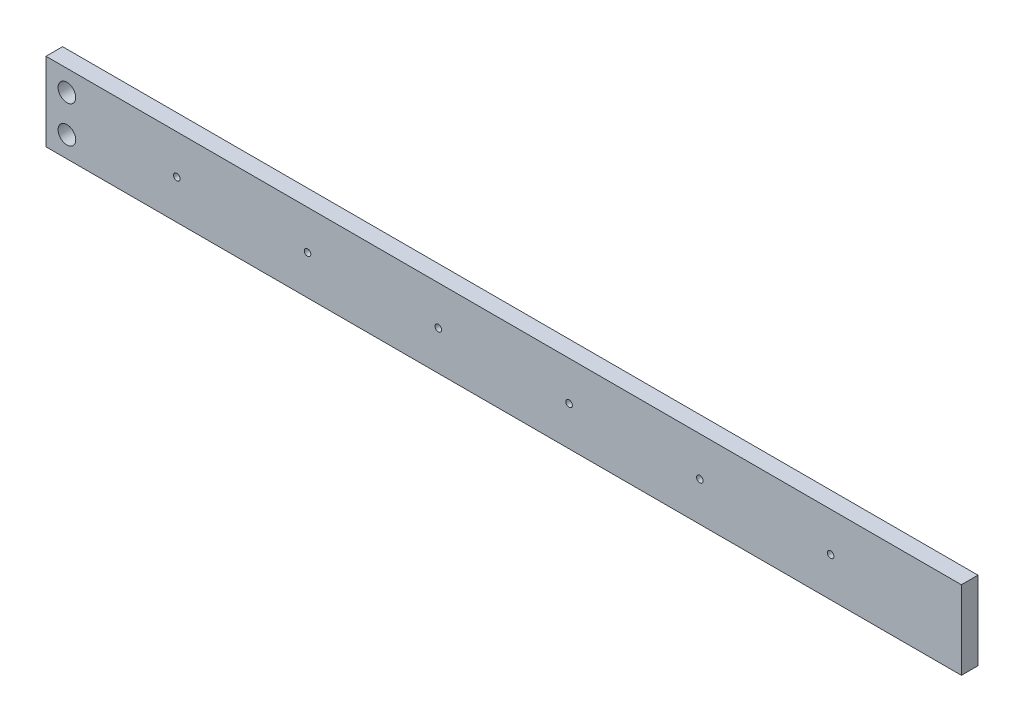
ISO-10303-21;
HEADER;
FILE_DESCRIPTION(('STEP AP214'),'2;1');
FILE_NAME('part.step','',(''),(''),'','','');
FILE_SCHEMA(('AUTOMOTIVE_DESIGN { 1 0 10303 214 1 1 1 1 }'));
ENDSEC;
DATA;
#1=APPLICATION_CONTEXT('core data for automotive mechanical design processes');
#2=APPLICATION_PROTOCOL_DEFINITION('international standard','automotive_design',2000,#1);
#3=PRODUCT_CONTEXT('',#1,'mechanical');
#4=PRODUCT('Part','Part','',(#3));
#5=PRODUCT_RELATED_PRODUCT_CATEGORY('part','',(#4));
#6=PRODUCT_DEFINITION_FORMATION('','',#4);
#7=PRODUCT_DEFINITION_CONTEXT('part definition',#1,'design');
#8=PRODUCT_DEFINITION('design','',#6,#7);
#9=PRODUCT_DEFINITION_SHAPE('','',#8);
#10=(LENGTH_UNIT() NAMED_UNIT(*) SI_UNIT(.MILLI.,.METRE.));
#11=(NAMED_UNIT(*) PLANE_ANGLE_UNIT() SI_UNIT($,.RADIAN.));
#12=(NAMED_UNIT(*) SI_UNIT($,.STERADIAN.) SOLID_ANGLE_UNIT());
#13=UNCERTAINTY_MEASURE_WITH_UNIT(LENGTH_MEASURE(1.E-05),#10,'distance_accuracy_value','');
#14=(GEOMETRIC_REPRESENTATION_CONTEXT(3) GLOBAL_UNCERTAINTY_ASSIGNED_CONTEXT((#13)) GLOBAL_UNIT_ASSIGNED_CONTEXT((#10,
#11,#12)) REPRESENTATION_CONTEXT('',''));
#15=CARTESIAN_POINT('',(0.,0.,0.));
#16=DIRECTION('',(0.,0.,1.));
#17=DIRECTION('',(1.,0.,0.));
#18=AXIS2_PLACEMENT_3D('',#15,#16,#17);
#19=CARTESIAN_POINT('',(300.,15.,6.35));
#20=DIRECTION('',(0.,0.,1.));
#21=DIRECTION('',(1.,0.,0.));
#22=AXIS2_PLACEMENT_3D('',#19,#20,#21);
#23=CYLINDRICAL_SURFACE('',#22,1.25);
#24=CARTESIAN_POINT('',(300.,15.,0.));
#25=DIRECTION('',(0.,0.,1.));
#26=DIRECTION('',(1.,0.,0.));
#27=AXIS2_PLACEMENT_3D('',#24,#25,#26);
#28=CIRCLE('',#27,1.25);
#29=CARTESIAN_POINT('',(301.25,15.,0.));
#30=VERTEX_POINT('',#29);
#31=EDGE_CURVE('E54',#30,#30,#28,.T.);
#32=ORIENTED_EDGE('',*,*,#31,.F.);
#33=EDGE_LOOP('',(#32));
#34=FACE_BOUND('',#33,.T.);
#35=CARTESIAN_POINT('',(300.,15.,6.35));
#36=DIRECTION('',(0.,0.,1.));
#37=DIRECTION('',(1.,0.,0.));
#38=AXIS2_PLACEMENT_3D('',#35,#36,#37);
#39=CIRCLE('',#38,1.25);
#40=CARTESIAN_POINT('',(301.25,15.,6.35));
#41=VERTEX_POINT('',#40);
#42=EDGE_CURVE('E11',#41,#41,#39,.T.);
#43=ORIENTED_EDGE('',*,*,#42,.T.);
#44=EDGE_LOOP('',(#43));
#45=FACE_BOUND('',#44,.T.);
#46=ADVANCED_FACE('F45',(#34,#45),#23,.F.);
#47=CARTESIAN_POINT('',(250.,15.,6.35));
#48=DIRECTION('',(0.,0.,1.));
#49=DIRECTION('',(1.,0.,0.));
#50=AXIS2_PLACEMENT_3D('',#47,#48,#49);
#51=CYLINDRICAL_SURFACE('',#50,1.25);
#52=CARTESIAN_POINT('',(250.,15.,0.));
#53=DIRECTION('',(0.,0.,1.));
#54=DIRECTION('',(1.,0.,0.));
#55=AXIS2_PLACEMENT_3D('',#52,#53,#54);
#56=CIRCLE('',#55,1.25);
#57=CARTESIAN_POINT('',(251.25,15.,0.));
#58=VERTEX_POINT('',#57);
#59=EDGE_CURVE('E151',#58,#58,#56,.T.);
#60=ORIENTED_EDGE('',*,*,#59,.F.);
#61=EDGE_LOOP('',(#60));
#62=FACE_BOUND('',#61,.T.);
#63=CARTESIAN_POINT('',(250.,15.,6.35));
#64=DIRECTION('',(0.,0.,1.));
#65=DIRECTION('',(1.,0.,0.));
#66=AXIS2_PLACEMENT_3D('',#63,#64,#65);
#67=CIRCLE('',#66,1.25);
#68=CARTESIAN_POINT('',(251.25,15.,6.35));
#69=VERTEX_POINT('',#68);
#70=EDGE_CURVE('E155',#69,#69,#67,.T.);
#71=ORIENTED_EDGE('',*,*,#70,.T.);
#72=EDGE_LOOP('',(#71));
#73=FACE_BOUND('',#72,.T.);
#74=ADVANCED_FACE('F166',(#62,#73),#51,.F.);
#75=CARTESIAN_POINT('',(200.,15.,6.35));
#76=DIRECTION('',(0.,0.,1.));
#77=DIRECTION('',(1.,0.,0.));
#78=AXIS2_PLACEMENT_3D('',#75,#76,#77);
#79=CYLINDRICAL_SURFACE('',#78,1.25);
#80=CARTESIAN_POINT('',(200.,15.,0.));
#81=DIRECTION('',(0.,0.,1.));
#82=DIRECTION('',(1.,0.,0.));
#83=AXIS2_PLACEMENT_3D('',#80,#81,#82);
#84=CIRCLE('',#83,1.25);
#85=CARTESIAN_POINT('',(201.25,15.,0.));
#86=VERTEX_POINT('',#85);
#87=EDGE_CURVE('E143',#86,#86,#84,.T.);
#88=ORIENTED_EDGE('',*,*,#87,.F.);
#89=EDGE_LOOP('',(#88));
#90=FACE_BOUND('',#89,.T.);
#91=CARTESIAN_POINT('',(200.,15.,6.35));
#92=DIRECTION('',(0.,0.,1.));
#93=DIRECTION('',(1.,0.,0.));
#94=AXIS2_PLACEMENT_3D('',#91,#92,#93);
#95=CIRCLE('',#94,1.25);
#96=CARTESIAN_POINT('',(201.25,15.,6.35));
#97=VERTEX_POINT('',#96);
#98=EDGE_CURVE('E147',#97,#97,#95,.T.);
#99=ORIENTED_EDGE('',*,*,#98,.T.);
#100=EDGE_LOOP('',(#99));
#101=FACE_BOUND('',#100,.T.);
#102=ADVANCED_FACE('F201',(#90,#101),#79,.F.);
#103=CARTESIAN_POINT('',(150.,15.,6.35));
#104=DIRECTION('',(0.,0.,1.));
#105=DIRECTION('',(1.,0.,0.));
#106=AXIS2_PLACEMENT_3D('',#103,#104,#105);
#107=CYLINDRICAL_SURFACE('',#106,1.25);
#108=CARTESIAN_POINT('',(150.,15.,0.));
#109=DIRECTION('',(0.,0.,1.));
#110=DIRECTION('',(1.,0.,0.));
#111=AXIS2_PLACEMENT_3D('',#108,#109,#110);
#112=CIRCLE('',#111,1.25);
#113=CARTESIAN_POINT('',(151.25,15.,0.));
#114=VERTEX_POINT('',#113);
#115=EDGE_CURVE('E135',#114,#114,#112,.T.);
#116=ORIENTED_EDGE('',*,*,#115,.F.);
#117=EDGE_LOOP('',(#116));
#118=FACE_BOUND('',#117,.T.);
#119=CARTESIAN_POINT('',(150.,15.,6.35));
#120=DIRECTION('',(0.,0.,1.));
#121=DIRECTION('',(1.,0.,0.));
#122=AXIS2_PLACEMENT_3D('',#119,#120,#121);
#123=CIRCLE('',#122,1.25);
#124=CARTESIAN_POINT('',(151.25,15.,6.35));
#125=VERTEX_POINT('',#124);
#126=EDGE_CURVE('E139',#125,#125,#123,.T.);
#127=ORIENTED_EDGE('',*,*,#126,.T.);
#128=EDGE_LOOP('',(#127));
#129=FACE_BOUND('',#128,.T.);
#130=ADVANCED_FACE('F189',(#118,#129),#107,.F.);
#131=CARTESIAN_POINT('',(0.,0.,0.));
#132=DIRECTION('',(0.,0.,-1.));
#133=DIRECTION('',(-1.,0.,0.));
#134=AXIS2_PLACEMENT_3D('',#131,#132,#133);
#135=PLANE('',#134);
#136=CARTESIAN_POINT('',(100.,15.,0.));
#137=DIRECTION('',(0.,0.,1.));
#138=DIRECTION('',(1.,0.,0.));
#139=AXIS2_PLACEMENT_3D('',#136,#137,#138);
#140=CIRCLE('',#139,1.25);
#141=CARTESIAN_POINT('',(101.25,15.,0.));
#142=VERTEX_POINT('',#141);
#143=EDGE_CURVE('E278',#142,#142,#140,.T.);
#144=ORIENTED_EDGE('',*,*,#143,.T.);
#145=EDGE_LOOP('',(#144));
#146=FACE_BOUND('',#145,.T.);
#147=CARTESIAN_POINT('',(50.,15.,0.));
#148=DIRECTION('',(0.,0.,1.));
#149=DIRECTION('',(1.,0.,0.));
#150=AXIS2_PLACEMENT_3D('',#147,#148,#149);
#151=CIRCLE('',#150,1.25);
#152=CARTESIAN_POINT('',(51.25,15.,0.));
#153=VERTEX_POINT('',#152);
#154=EDGE_CURVE('E287',#153,#153,#151,.T.);
#155=ORIENTED_EDGE('',*,*,#154,.T.);
#156=EDGE_LOOP('',(#155));
#157=FACE_BOUND('',#156,.T.);
#158=CARTESIAN_POINT('',(8.00000000000001,22.,0.));
#159=DIRECTION('',(0.,0.,1.));
#160=DIRECTION('',(1.,0.,0.));
#161=AXIS2_PLACEMENT_3D('',#158,#159,#160);
#162=CIRCLE('',#161,3.3782);
#163=CARTESIAN_POINT('',(11.3782,22.,0.));
#164=VERTEX_POINT('',#163);
#165=EDGE_CURVE('E298',#164,#164,#162,.T.);
#166=ORIENTED_EDGE('',*,*,#165,.T.);
#167=EDGE_LOOP('',(#166));
#168=FACE_BOUND('',#167,.T.);
#169=DIRECTION('',(0.,-1.,0.));
#170=VECTOR('',#169,1.);
#171=CARTESIAN_POINT('',(0.,0.,0.));
#172=LINE('',#171,#170);
#173=CARTESIAN_POINT('',(0.,30.,0.));
#174=VERTEX_POINT('',#173);
#175=CARTESIAN_POINT('',(0.,0.,0.));
#176=VERTEX_POINT('',#175);
#177=EDGE_CURVE('E118',#174,#176,#172,.T.);
#178=ORIENTED_EDGE('',*,*,#177,.F.);
#179=DIRECTION('',(-1.,0.,0.));
#180=VECTOR('',#179,1.);
#181=CARTESIAN_POINT('',(0.,30.,0.));
#182=LINE('',#181,#180);
#183=CARTESIAN_POINT('',(350.,30.,0.));
#184=VERTEX_POINT('',#183);
#185=EDGE_CURVE('E85',#184,#174,#182,.T.);
#186=ORIENTED_EDGE('',*,*,#185,.F.);
#187=DIRECTION('',(0.,1.,0.));
#188=VECTOR('',#187,1.);
#189=CARTESIAN_POINT('',(350.,0.,0.));
#190=LINE('',#189,#188);
#191=CARTESIAN_POINT('',(350.,0.,0.));
#192=VERTEX_POINT('',#191);
#193=EDGE_CURVE('E79',#192,#184,#190,.T.);
#194=ORIENTED_EDGE('',*,*,#193,.F.);
#195=DIRECTION('',(1.,0.,0.));
#196=VECTOR('',#195,1.);
#197=CARTESIAN_POINT('',(0.,0.,0.));
#198=LINE('',#197,#196);
#199=EDGE_CURVE('E105',#176,#192,#198,.T.);
#200=ORIENTED_EDGE('',*,*,#199,.F.);
#201=EDGE_LOOP('',(#178,#186,#194,#200));
#202=FACE_BOUND('',#201,.T.);
#203=CARTESIAN_POINT('',(8.,8.,0.));
#204=DIRECTION('',(0.,0.,1.));
#205=DIRECTION('',(1.,0.,0.));
#206=AXIS2_PLACEMENT_3D('',#203,#204,#205);
#207=CIRCLE('',#206,3.3782);
#208=CARTESIAN_POINT('',(11.3782,8.,0.));
#209=VERTEX_POINT('',#208);
#210=EDGE_CURVE('E122',#209,#209,#207,.T.);
#211=ORIENTED_EDGE('',*,*,#210,.T.);
#212=EDGE_LOOP('',(#211));
#213=FACE_BOUND('',#212,.T.);
#214=ORIENTED_EDGE('',*,*,#115,.T.);
#215=EDGE_LOOP('',(#214));
#216=FACE_BOUND('',#215,.T.);
#217=ORIENTED_EDGE('',*,*,#87,.T.);
#218=EDGE_LOOP('',(#217));
#219=FACE_BOUND('',#218,.T.);
#220=ORIENTED_EDGE('',*,*,#59,.T.);
#221=EDGE_LOOP('',(#220));
#222=FACE_BOUND('',#221,.T.);
#223=ORIENTED_EDGE('',*,*,#31,.T.);
#224=EDGE_LOOP('',(#223));
#225=FACE_BOUND('',#224,.T.);
#226=ADVANCED_FACE('F162',(#146,#157,#168,#202,#213,#216,#219,#222,#225),#135,.T.);
#227=CARTESIAN_POINT('',(0.,0.,6.35));
#228=DIRECTION('',(1.,0.,0.));
#229=DIRECTION('',(0.,0.,-1.));
#230=AXIS2_PLACEMENT_3D('',#227,#228,#229);
#231=PLANE('',#230);
#232=ORIENTED_EDGE('',*,*,#177,.T.);
#233=DIRECTION('',(0.,0.,-1.));
#234=VECTOR('',#233,1.);
#235=CARTESIAN_POINT('',(0.,0.,6.35));
#236=LINE('',#235,#234);
#237=CARTESIAN_POINT('',(0.,0.,6.35));
#238=VERTEX_POINT('',#237);
#239=EDGE_CURVE('E107',#238,#176,#236,.T.);
#240=ORIENTED_EDGE('',*,*,#239,.F.);
#241=DIRECTION('',(0.,-1.,0.));
#242=VECTOR('',#241,1.);
#243=CARTESIAN_POINT('',(0.,0.,6.35));
#244=LINE('',#243,#242);
#245=CARTESIAN_POINT('',(0.,30.,6.35));
#246=VERTEX_POINT('',#245);
#247=EDGE_CURVE('E99',#246,#238,#244,.T.);
#248=ORIENTED_EDGE('',*,*,#247,.F.);
#249=DIRECTION('',(0.,0.,-1.));
#250=VECTOR('',#249,1.);
#251=CARTESIAN_POINT('',(0.,30.,6.35));
#252=LINE('',#251,#250);
#253=EDGE_CURVE('E114',#246,#174,#252,.T.);
#254=ORIENTED_EDGE('',*,*,#253,.T.);
#255=EDGE_LOOP('',(#232,#240,#248,#254));
#256=FACE_BOUND('',#255,.T.);
#257=ADVANCED_FACE('F188',(#256),#231,.F.);
#258=CARTESIAN_POINT('',(0.,0.,6.35));
#259=DIRECTION('',(0.,1.,0.));
#260=DIRECTION('',(0.,0.,1.));
#261=AXIS2_PLACEMENT_3D('',#258,#259,#260);
#262=PLANE('',#261);
#263=ORIENTED_EDGE('',*,*,#199,.T.);
#264=DIRECTION('',(0.,0.,-1.));
#265=VECTOR('',#264,1.);
#266=CARTESIAN_POINT('',(350.,0.,6.35));
#267=LINE('',#266,#265);
#268=CARTESIAN_POINT('',(350.,0.,6.35));
#269=VERTEX_POINT('',#268);
#270=EDGE_CURVE('E103',#269,#192,#267,.T.);
#271=ORIENTED_EDGE('',*,*,#270,.F.);
#272=DIRECTION('',(1.,0.,0.));
#273=VECTOR('',#272,1.);
#274=CARTESIAN_POINT('',(0.,0.,6.35));
#275=LINE('',#274,#273);
#276=EDGE_CURVE('E93',#238,#269,#275,.T.);
#277=ORIENTED_EDGE('',*,*,#276,.F.);
#278=ORIENTED_EDGE('',*,*,#239,.T.);
#279=EDGE_LOOP('',(#263,#271,#277,#278));
#280=FACE_BOUND('',#279,.T.);
#281=ADVANCED_FACE('F104',(#280),#262,.F.);
#282=CARTESIAN_POINT('',(350.,0.,6.35));
#283=DIRECTION('',(-1.,0.,0.));
#284=DIRECTION('',(0.,0.,1.));
#285=AXIS2_PLACEMENT_3D('',#282,#283,#284);
#286=PLANE('',#285);
#287=ORIENTED_EDGE('',*,*,#193,.T.);
#288=DIRECTION('',(0.,0.,-1.));
#289=VECTOR('',#288,1.);
#290=CARTESIAN_POINT('',(350.,30.,6.35));
#291=LINE('',#290,#289);
#292=CARTESIAN_POINT('',(350.,30.,6.35));
#293=VERTEX_POINT('',#292);
#294=EDGE_CURVE('E108',#293,#184,#291,.T.);
#295=ORIENTED_EDGE('',*,*,#294,.F.);
#296=DIRECTION('',(0.,1.,0.));
#297=VECTOR('',#296,1.);
#298=CARTESIAN_POINT('',(350.,0.,6.35));
#299=LINE('',#298,#297);
#300=EDGE_CURVE('E97',#269,#293,#299,.T.);
#301=ORIENTED_EDGE('',*,*,#300,.F.);
#302=ORIENTED_EDGE('',*,*,#270,.T.);
#303=EDGE_LOOP('',(#287,#295,#301,#302));
#304=FACE_BOUND('',#303,.T.);
#305=ADVANCED_FACE('F110',(#304),#286,.F.);
#306=CARTESIAN_POINT('',(0.,30.,6.35));
#307=DIRECTION('',(0.,-1.,0.));
#308=DIRECTION('',(0.,0.,-1.));
#309=AXIS2_PLACEMENT_3D('',#306,#307,#308);
#310=PLANE('',#309);
#311=ORIENTED_EDGE('',*,*,#185,.T.);
#312=ORIENTED_EDGE('',*,*,#253,.F.);
#313=DIRECTION('',(-1.,0.,0.));
#314=VECTOR('',#313,1.);
#315=CARTESIAN_POINT('',(0.,30.,6.35));
#316=LINE('',#315,#314);
#317=EDGE_CURVE('E62',#293,#246,#316,.T.);
#318=ORIENTED_EDGE('',*,*,#317,.F.);
#319=ORIENTED_EDGE('',*,*,#294,.T.);
#320=EDGE_LOOP('',(#311,#312,#318,#319));
#321=FACE_BOUND('',#320,.T.);
#322=ADVANCED_FACE('F171',(#321),#310,.F.);
#323=CARTESIAN_POINT('',(0.,0.,6.35));
#324=DIRECTION('',(0.,0.,-1.));
#325=DIRECTION('',(-1.,0.,0.));
#326=AXIS2_PLACEMENT_3D('',#323,#324,#325);
#327=PLANE('',#326);
#328=CARTESIAN_POINT('',(100.,15.,6.35));
#329=DIRECTION('',(0.,0.,1.));
#330=DIRECTION('',(1.,0.,0.));
#331=AXIS2_PLACEMENT_3D('',#328,#329,#330);
#332=CIRCLE('',#331,1.25);
#333=CARTESIAN_POINT('',(101.25,15.,6.35));
#334=VERTEX_POINT('',#333);
#335=EDGE_CURVE('E280',#334,#334,#332,.T.);
#336=ORIENTED_EDGE('',*,*,#335,.F.);
#337=EDGE_LOOP('',(#336));
#338=FACE_BOUND('',#337,.T.);
#339=CARTESIAN_POINT('',(50.,15.,6.35));
#340=DIRECTION('',(0.,0.,1.));
#341=DIRECTION('',(1.,0.,0.));
#342=AXIS2_PLACEMENT_3D('',#339,#340,#341);
#343=CIRCLE('',#342,1.25);
#344=CARTESIAN_POINT('',(51.25,15.,6.35));
#345=VERTEX_POINT('',#344);
#346=EDGE_CURVE('E282',#345,#345,#343,.T.);
#347=ORIENTED_EDGE('',*,*,#346,.F.);
#348=EDGE_LOOP('',(#347));
#349=FACE_BOUND('',#348,.T.);
#350=CARTESIAN_POINT('',(8.00000000000001,22.,6.35));
#351=DIRECTION('',(0.,0.,1.));
#352=DIRECTION('',(1.,0.,0.));
#353=AXIS2_PLACEMENT_3D('',#350,#351,#352);
#354=CIRCLE('',#353,3.3782);
#355=CARTESIAN_POINT('',(11.3782,22.,6.35));
#356=VERTEX_POINT('',#355);
#357=EDGE_CURVE('E294',#356,#356,#354,.T.);
#358=ORIENTED_EDGE('',*,*,#357,.F.);
#359=EDGE_LOOP('',(#358));
#360=FACE_BOUND('',#359,.T.);
#361=CARTESIAN_POINT('',(8.,8.,6.35));
#362=DIRECTION('',(0.,0.,1.));
#363=DIRECTION('',(1.,0.,0.));
#364=AXIS2_PLACEMENT_3D('',#361,#362,#363);
#365=CIRCLE('',#364,3.3782);
#366=CARTESIAN_POINT('',(11.3782,8.,6.35));
#367=VERTEX_POINT('',#366);
#368=EDGE_CURVE('E302',#367,#367,#365,.T.);
#369=ORIENTED_EDGE('',*,*,#368,.F.);
#370=EDGE_LOOP('',(#369));
#371=FACE_BOUND('',#370,.T.);
#372=ORIENTED_EDGE('',*,*,#247,.T.);
#373=ORIENTED_EDGE('',*,*,#276,.T.);
#374=ORIENTED_EDGE('',*,*,#300,.T.);
#375=ORIENTED_EDGE('',*,*,#317,.T.);
#376=EDGE_LOOP('',(#372,#373,#374,#375));
#377=FACE_BOUND('',#376,.T.);
#378=ORIENTED_EDGE('',*,*,#126,.F.);
#379=EDGE_LOOP('',(#378));
#380=FACE_BOUND('',#379,.T.);
#381=ORIENTED_EDGE('',*,*,#98,.F.);
#382=EDGE_LOOP('',(#381));
#383=FACE_BOUND('',#382,.T.);
#384=ORIENTED_EDGE('',*,*,#70,.F.);
#385=EDGE_LOOP('',(#384));
#386=FACE_BOUND('',#385,.T.);
#387=ORIENTED_EDGE('',*,*,#42,.F.);
#388=EDGE_LOOP('',(#387));
#389=FACE_BOUND('',#388,.T.);
#390=ADVANCED_FACE('F94',(#338,#349,#360,#371,#377,#380,#383,#386,#389),#327,.F.);
#391=CARTESIAN_POINT('',(8.,8.,6.35));
#392=DIRECTION('',(0.,0.,1.));
#393=DIRECTION('',(1.,0.,0.));
#394=AXIS2_PLACEMENT_3D('',#391,#392,#393);
#395=CYLINDRICAL_SURFACE('',#394,3.3782);
#396=ORIENTED_EDGE('',*,*,#210,.F.);
#397=EDGE_LOOP('',(#396));
#398=FACE_BOUND('',#397,.T.);
#399=ORIENTED_EDGE('',*,*,#368,.T.);
#400=EDGE_LOOP('',(#399));
#401=FACE_BOUND('',#400,.T.);
#402=ADVANCED_FACE('F170',(#398,#401),#395,.F.);
#403=CARTESIAN_POINT('',(8.00000000000001,22.,6.35));
#404=DIRECTION('',(0.,0.,1.));
#405=DIRECTION('',(1.,0.,0.));
#406=AXIS2_PLACEMENT_3D('',#403,#404,#405);
#407=CYLINDRICAL_SURFACE('',#406,3.3782);
#408=ORIENTED_EDGE('',*,*,#165,.F.);
#409=EDGE_LOOP('',(#408));
#410=FACE_BOUND('',#409,.T.);
#411=ORIENTED_EDGE('',*,*,#357,.T.);
#412=EDGE_LOOP('',(#411));
#413=FACE_BOUND('',#412,.T.);
#414=ADVANCED_FACE('F179',(#410,#413),#407,.F.);
#415=CARTESIAN_POINT('',(50.,15.,6.35));
#416=DIRECTION('',(0.,0.,1.));
#417=DIRECTION('',(1.,0.,0.));
#418=AXIS2_PLACEMENT_3D('',#415,#416,#417);
#419=CYLINDRICAL_SURFACE('',#418,1.25);
#420=ORIENTED_EDGE('',*,*,#154,.F.);
#421=EDGE_LOOP('',(#420));
#422=FACE_BOUND('',#421,.T.);
#423=ORIENTED_EDGE('',*,*,#346,.T.);
#424=EDGE_LOOP('',(#423));
#425=FACE_BOUND('',#424,.T.);
#426=ADVANCED_FACE('F250',(#422,#425),#419,.F.);
#427=CARTESIAN_POINT('',(100.,15.,6.35));
#428=DIRECTION('',(0.,0.,1.));
#429=DIRECTION('',(1.,0.,0.));
#430=AXIS2_PLACEMENT_3D('',#427,#428,#429);
#431=CYLINDRICAL_SURFACE('',#430,1.25);
#432=ORIENTED_EDGE('',*,*,#143,.F.);
#433=EDGE_LOOP('',(#432));
#434=FACE_BOUND('',#433,.T.);
#435=ORIENTED_EDGE('',*,*,#335,.T.);
#436=EDGE_LOOP('',(#435));
#437=FACE_BOUND('',#436,.T.);
#438=ADVANCED_FACE('F257',(#434,#437),#431,.F.);
#439=CLOSED_SHELL('',(#46,#74,#102,#130,#226,#257,#281,#305,#322,#390,#402,#414,#426,#438));
#440=MANIFOLD_SOLID_BREP('B2',#439);
#441=ADVANCED_BREP_SHAPE_REPRESENTATION('',(#18,#440),#14);
#442=SHAPE_DEFINITION_REPRESENTATION(#9,#441);
ENDSEC;
END-ISO-10303-21;
